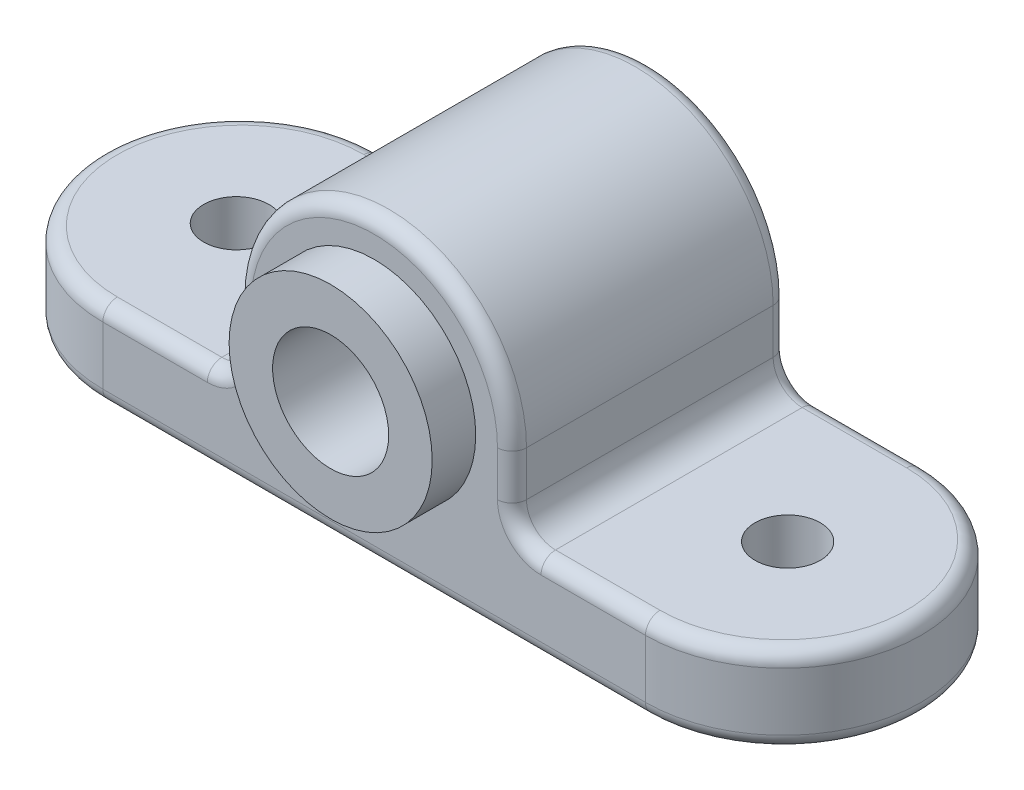
ISO-10303-21;
HEADER;
FILE_DESCRIPTION(('STEP AP214'),'2;1');
FILE_NAME('part.step','',(''),(''),'','','');
FILE_SCHEMA(('AUTOMOTIVE_DESIGN { 1 0 10303 214 1 1 1 1 }'));
ENDSEC;
DATA;
#1=APPLICATION_CONTEXT('core data for automotive mechanical design processes');
#2=APPLICATION_PROTOCOL_DEFINITION('international standard','automotive_design',2000,#1);
#3=PRODUCT_CONTEXT('',#1,'mechanical');
#4=PRODUCT('Part','Part','',(#3));
#5=PRODUCT_RELATED_PRODUCT_CATEGORY('part','',(#4));
#6=PRODUCT_DEFINITION_FORMATION('','',#4);
#7=PRODUCT_DEFINITION_CONTEXT('part definition',#1,'design');
#8=PRODUCT_DEFINITION('design','',#6,#7);
#9=PRODUCT_DEFINITION_SHAPE('','',#8);
#10=(LENGTH_UNIT() NAMED_UNIT(*) SI_UNIT(.MILLI.,.METRE.));
#11=(NAMED_UNIT(*) PLANE_ANGLE_UNIT() SI_UNIT($,.RADIAN.));
#12=(NAMED_UNIT(*) SI_UNIT($,.STERADIAN.) SOLID_ANGLE_UNIT());
#13=UNCERTAINTY_MEASURE_WITH_UNIT(LENGTH_MEASURE(1.E-05),#10,'distance_accuracy_value','');
#14=(GEOMETRIC_REPRESENTATION_CONTEXT(3) GLOBAL_UNCERTAINTY_ASSIGNED_CONTEXT((#13)) GLOBAL_UNIT_ASSIGNED_CONTEXT((#10,
#11,#12)) REPRESENTATION_CONTEXT('',''));
#15=CARTESIAN_POINT('',(0.,0.,0.));
#16=DIRECTION('',(0.,0.,1.));
#17=DIRECTION('',(1.,0.,0.));
#18=AXIS2_PLACEMENT_3D('',#15,#16,#17);
#19=CARTESIAN_POINT('',(11.5,8.,19.));
#20=DIRECTION('',(0.,0.,1.));
#21=DIRECTION('',(1.,0.,0.));
#22=AXIS2_PLACEMENT_3D('',#19,#20,#21);
#23=PLANE('',#22);
#24=DIRECTION('',(0.,-1.,0.));
#25=VECTOR('',#24,1.);
#26=CARTESIAN_POINT('',(-18.7,19.,19.));
#27=LINE('',#26,#25);
#28=CARTESIAN_POINT('',(-18.7,4.99999999999999,19.));
#29=VERTEX_POINT('',#28);
#30=CARTESIAN_POINT('',(-18.7,1.,19.));
#31=VERTEX_POINT('',#30);
#32=EDGE_CURVE('E402',#29,#31,#27,.T.);
#33=ORIENTED_EDGE('',*,*,#32,.T.);
#34=DIRECTION('',(1.,0.,0.));
#35=VECTOR('',#34,1.);
#36=CARTESIAN_POINT('',(18.7,1.,19.));
#37=LINE('',#36,#35);
#38=CARTESIAN_POINT('',(18.7,1.,19.));
#39=VERTEX_POINT('',#38);
#40=EDGE_CURVE('E305',#31,#39,#37,.T.);
#41=ORIENTED_EDGE('',*,*,#40,.T.);
#42=DIRECTION('',(0.,-1.,0.));
#43=VECTOR('',#42,1.);
#44=CARTESIAN_POINT('',(18.7,19.,19.));
#45=LINE('',#44,#43);
#46=CARTESIAN_POINT('',(18.7,5.,19.));
#47=VERTEX_POINT('',#46);
#48=EDGE_CURVE('E415',#47,#39,#45,.T.);
#49=ORIENTED_EDGE('',*,*,#48,.F.);
#50=DIRECTION('',(-1.,0.,0.));
#51=VECTOR('',#50,1.);
#52=CARTESIAN_POINT('',(11.5,5.,19.));
#53=LINE('',#52,#51);
#54=CARTESIAN_POINT('',(11.5,5.,19.));
#55=VERTEX_POINT('',#54);
#56=EDGE_CURVE('E291',#47,#55,#53,.T.);
#57=ORIENTED_EDGE('',*,*,#56,.T.);
#58=CARTESIAN_POINT('',(11.5,8.,19.));
#59=DIRECTION('',(0.,0.,1.));
#60=DIRECTION('',(1.,0.,0.));
#61=AXIS2_PLACEMENT_3D('',#58,#59,#60);
#62=CIRCLE('',#61,3.);
#63=CARTESIAN_POINT('',(8.5,8.00000000000001,19.));
#64=VERTEX_POINT('',#63);
#65=EDGE_CURVE('E293',#55,#64,#62,.F.);
#66=ORIENTED_EDGE('',*,*,#65,.T.);
#67=DIRECTION('',(0.,1.,0.));
#68=VECTOR('',#67,1.);
#69=CARTESIAN_POINT('',(8.5,11.1,19.));
#70=LINE('',#69,#68);
#71=CARTESIAN_POINT('',(8.5,11.1,19.));
#72=VERTEX_POINT('',#71);
#73=EDGE_CURVE('E295',#64,#72,#70,.T.);
#74=ORIENTED_EDGE('',*,*,#73,.T.);
#75=CARTESIAN_POINT('',(0.,11.1,19.));
#76=DIRECTION('',(0.,0.,1.));
#77=DIRECTION('',(1.,0.,0.));
#78=AXIS2_PLACEMENT_3D('',#75,#76,#77);
#79=CIRCLE('',#78,8.5);
#80=CARTESIAN_POINT('',(-8.5,11.1,19.));
#81=VERTEX_POINT('',#80);
#82=EDGE_CURVE('E297',#72,#81,#79,.T.);
#83=ORIENTED_EDGE('',*,*,#82,.T.);
#84=DIRECTION('',(0.,-1.,0.));
#85=VECTOR('',#84,1.);
#86=CARTESIAN_POINT('',(-8.5,8.,19.));
#87=LINE('',#86,#85);
#88=CARTESIAN_POINT('',(-8.5,8.00000000000001,19.));
#89=VERTEX_POINT('',#88);
#90=EDGE_CURVE('E299',#81,#89,#87,.T.);
#91=ORIENTED_EDGE('',*,*,#90,.T.);
#92=CARTESIAN_POINT('',(-11.5,7.99999999999999,19.));
#93=DIRECTION('',(0.,0.,1.));
#94=DIRECTION('',(1.,0.,0.));
#95=AXIS2_PLACEMENT_3D('',#92,#93,#94);
#96=CIRCLE('',#95,3.);
#97=CARTESIAN_POINT('',(-11.5,4.99999999999999,19.));
#98=VERTEX_POINT('',#97);
#99=EDGE_CURVE('E301',#89,#98,#96,.F.);
#100=ORIENTED_EDGE('',*,*,#99,.T.);
#101=DIRECTION('',(-1.,0.,0.));
#102=VECTOR('',#101,1.);
#103=CARTESIAN_POINT('',(-18.7,4.99999999999999,19.));
#104=LINE('',#103,#102);
#105=EDGE_CURVE('E303',#98,#29,#104,.T.);
#106=ORIENTED_EDGE('',*,*,#105,.T.);
#107=EDGE_LOOP('',(#33,#41,#49,#57,#66,#74,#83,#91,#100,#106));
#108=FACE_BOUND('',#107,.T.);
#109=CARTESIAN_POINT('',(0.,11.1,19.));
#110=DIRECTION('',(0.,0.,1.));
#111=DIRECTION('',(1.,0.,0.));
#112=AXIS2_PLACEMENT_3D('',#109,#110,#111);
#113=CIRCLE('',#112,7.);
#114=CARTESIAN_POINT('',(7.,11.1,19.));
#115=VERTEX_POINT('',#114);
#116=EDGE_CURVE('E463',#115,#115,#113,.T.);
#117=ORIENTED_EDGE('',*,*,#116,.F.);
#118=EDGE_LOOP('',(#117));
#119=FACE_BOUND('',#118,.T.);
#120=ADVANCED_FACE('F103',(#108,#119),#23,.T.);
#121=CARTESIAN_POINT('',(28.2,6.,19.));
#122=DIRECTION('',(0.,-1.,0.));
#123=DIRECTION('',(1.,0.,0.));
#124=AXIS2_PLACEMENT_3D('',#121,#122,#123);
#125=PLANE('',#124);
#126=CARTESIAN_POINT('',(19.,6.,9.5));
#127=DIRECTION('',(0.,-1.,0.));
#128=DIRECTION('',(1.,0.,0.));
#129=AXIS2_PLACEMENT_3D('',#126,#127,#128);
#130=CIRCLE('',#129,2.25);
#131=CARTESIAN_POINT('',(21.25,6.,9.5));
#132=VERTEX_POINT('',#131);
#133=EDGE_CURVE('E452',#132,#132,#130,.T.);
#134=ORIENTED_EDGE('',*,*,#133,.T.);
#135=EDGE_LOOP('',(#134));
#136=FACE_BOUND('',#135,.T.);
#137=CARTESIAN_POINT('',(18.7,6.,9.50000000000001));
#138=DIRECTION('',(0.,-1.,0.));
#139=DIRECTION('',(1.,0.,0.));
#140=AXIS2_PLACEMENT_3D('',#137,#138,#139);
#141=CIRCLE('',#140,8.5);
#142=CARTESIAN_POINT('',(18.7,6.,18.));
#143=VERTEX_POINT('',#142);
#144=CARTESIAN_POINT('',(18.7,6.,1.));
#145=VERTEX_POINT('',#144);
#146=EDGE_CURVE('E307',#143,#145,#141,.F.);
#147=ORIENTED_EDGE('',*,*,#146,.T.);
#148=DIRECTION('',(-1.,0.,0.));
#149=VECTOR('',#148,1.);
#150=CARTESIAN_POINT('',(28.2,6.,1.));
#151=LINE('',#150,#149);
#152=CARTESIAN_POINT('',(11.5,6.,1.));
#153=VERTEX_POINT('',#152);
#154=EDGE_CURVE('E311',#145,#153,#151,.T.);
#155=ORIENTED_EDGE('',*,*,#154,.T.);
#156=DIRECTION('',(0.,0.,-1.));
#157=VECTOR('',#156,1.);
#158=CARTESIAN_POINT('',(11.5,6.,19.));
#159=LINE('',#158,#157);
#160=CARTESIAN_POINT('',(11.5,6.,18.));
#161=VERTEX_POINT('',#160);
#162=EDGE_CURVE('E260',#161,#153,#159,.T.);
#163=ORIENTED_EDGE('',*,*,#162,.F.);
#164=DIRECTION('',(-1.,0.,0.));
#165=VECTOR('',#164,1.);
#166=CARTESIAN_POINT('',(18.7,6.,18.));
#167=LINE('',#166,#165);
#168=EDGE_CURVE('E309',#161,#143,#167,.F.);
#169=ORIENTED_EDGE('',*,*,#168,.T.);
#170=EDGE_LOOP('',(#147,#155,#163,#169));
#171=FACE_BOUND('',#170,.T.);
#172=ADVANCED_FACE('F489',(#136,#171),#125,.F.);
#173=CARTESIAN_POINT('',(-28.2,0.,19.));
#174=DIRECTION('',(0.,1.,0.));
#175=DIRECTION('',(0.,0.,1.));
#176=AXIS2_PLACEMENT_3D('',#173,#174,#175);
#177=PLANE('',#176);
#178=CARTESIAN_POINT('',(-18.7,0.,9.5));
#179=DIRECTION('',(0.,1.,0.));
#180=DIRECTION('',(0.,0.,1.));
#181=AXIS2_PLACEMENT_3D('',#178,#179,#180);
#182=CIRCLE('',#181,8.5);
#183=CARTESIAN_POINT('',(-18.7,0.,18.));
#184=VERTEX_POINT('',#183);
#185=CARTESIAN_POINT('',(-18.7,0.,1.));
#186=VERTEX_POINT('',#185);
#187=EDGE_CURVE('E265',#184,#186,#182,.F.);
#188=ORIENTED_EDGE('',*,*,#187,.T.);
#189=DIRECTION('',(1.,0.,0.));
#190=VECTOR('',#189,1.);
#191=CARTESIAN_POINT('',(-28.2,0.,1.));
#192=LINE('',#191,#190);
#193=CARTESIAN_POINT('',(18.7,0.,1.));
#194=VERTEX_POINT('',#193);
#195=EDGE_CURVE('E245',#186,#194,#192,.T.);
#196=ORIENTED_EDGE('',*,*,#195,.T.);
#197=CARTESIAN_POINT('',(18.7,0.,9.50000000000001));
#198=DIRECTION('',(0.,1.,0.));
#199=DIRECTION('',(0.,0.,1.));
#200=AXIS2_PLACEMENT_3D('',#197,#198,#199);
#201=CIRCLE('',#200,8.5);
#202=CARTESIAN_POINT('',(18.7,0.,18.));
#203=VERTEX_POINT('',#202);
#204=EDGE_CURVE('E253',#194,#203,#201,.F.);
#205=ORIENTED_EDGE('',*,*,#204,.T.);
#206=DIRECTION('',(1.,0.,0.));
#207=VECTOR('',#206,1.);
#208=CARTESIAN_POINT('',(-18.7,0.,18.));
#209=LINE('',#208,#207);
#210=EDGE_CURVE('E259',#203,#184,#209,.F.);
#211=ORIENTED_EDGE('',*,*,#210,.T.);
#212=EDGE_LOOP('',(#188,#196,#205,#211));
#213=FACE_BOUND('',#212,.T.);
#214=CARTESIAN_POINT('',(-19.,0.,9.5));
#215=DIRECTION('',(0.,-1.,0.));
#216=DIRECTION('',(0.,0.,-1.));
#217=AXIS2_PLACEMENT_3D('',#214,#215,#216);
#218=CIRCLE('',#217,2.25);
#219=CARTESIAN_POINT('',(-19.,0.,7.25));
#220=VERTEX_POINT('',#219);
#221=EDGE_CURVE('E437',#220,#220,#218,.T.);
#222=ORIENTED_EDGE('',*,*,#221,.F.);
#223=EDGE_LOOP('',(#222));
#224=FACE_BOUND('',#223,.T.);
#225=CARTESIAN_POINT('',(19.,0.,9.5));
#226=DIRECTION('',(0.,-1.,0.));
#227=DIRECTION('',(0.,0.,-1.));
#228=AXIS2_PLACEMENT_3D('',#225,#226,#227);
#229=CIRCLE('',#228,2.25);
#230=CARTESIAN_POINT('',(19.,0.,7.25));
#231=VERTEX_POINT('',#230);
#232=EDGE_CURVE('E436',#231,#231,#229,.T.);
#233=ORIENTED_EDGE('',*,*,#232,.F.);
#234=EDGE_LOOP('',(#233));
#235=FACE_BOUND('',#234,.T.);
#236=ADVANCED_FACE('F262',(#213,#224,#235),#177,.F.);
#237=CARTESIAN_POINT('',(11.5,8.,0.));
#238=DIRECTION('',(0.,0.,1.));
#239=DIRECTION('',(1.,0.,0.));
#240=AXIS2_PLACEMENT_3D('',#237,#238,#239);
#241=PLANE('',#240);
#242=DIRECTION('',(0.,-1.,0.));
#243=VECTOR('',#242,1.);
#244=CARTESIAN_POINT('',(18.7,19.,0.));
#245=LINE('',#244,#243);
#246=CARTESIAN_POINT('',(18.7,5.,0.));
#247=VERTEX_POINT('',#246);
#248=CARTESIAN_POINT('',(18.7,1.,0.));
#249=VERTEX_POINT('',#248);
#250=EDGE_CURVE('E449',#247,#249,#245,.T.);
#251=ORIENTED_EDGE('',*,*,#250,.T.);
#252=DIRECTION('',(1.,0.,0.));
#253=VECTOR('',#252,1.);
#254=CARTESIAN_POINT('',(11.5,1.,0.));
#255=LINE('',#254,#253);
#256=CARTESIAN_POINT('',(-18.7,1.,0.));
#257=VERTEX_POINT('',#256);
#258=EDGE_CURVE('E247',#249,#257,#255,.F.);
#259=ORIENTED_EDGE('',*,*,#258,.T.);
#260=DIRECTION('',(0.,-1.,0.));
#261=VECTOR('',#260,1.);
#262=CARTESIAN_POINT('',(-18.7,19.,0.));
#263=LINE('',#262,#261);
#264=CARTESIAN_POINT('',(-18.7,5.,0.));
#265=VERTEX_POINT('',#264);
#266=EDGE_CURVE('E410',#265,#257,#263,.T.);
#267=ORIENTED_EDGE('',*,*,#266,.F.);
#268=DIRECTION('',(-1.,0.,0.));
#269=VECTOR('',#268,1.);
#270=CARTESIAN_POINT('',(11.5,4.99999999999999,0.));
#271=LINE('',#270,#269);
#272=CARTESIAN_POINT('',(-11.5,4.99999999999999,0.));
#273=VERTEX_POINT('',#272);
#274=EDGE_CURVE('E267',#265,#273,#271,.F.);
#275=ORIENTED_EDGE('',*,*,#274,.T.);
#276=CARTESIAN_POINT('',(-11.5,7.99999999999999,0.));
#277=DIRECTION('',(0.,0.,1.));
#278=DIRECTION('',(1.,0.,0.));
#279=AXIS2_PLACEMENT_3D('',#276,#277,#278);
#280=CIRCLE('',#279,3.);
#281=CARTESIAN_POINT('',(-8.5,8.,0.));
#282=VERTEX_POINT('',#281);
#283=EDGE_CURVE('E269',#273,#282,#280,.T.);
#284=ORIENTED_EDGE('',*,*,#283,.T.);
#285=DIRECTION('',(0.,-1.,0.));
#286=VECTOR('',#285,1.);
#287=CARTESIAN_POINT('',(-8.5,8.,0.));
#288=LINE('',#287,#286);
#289=CARTESIAN_POINT('',(-8.5,11.1,0.));
#290=VERTEX_POINT('',#289);
#291=EDGE_CURVE('E275',#282,#290,#288,.F.);
#292=ORIENTED_EDGE('',*,*,#291,.T.);
#293=CARTESIAN_POINT('',(0.,11.1,0.));
#294=DIRECTION('',(0.,0.,1.));
#295=DIRECTION('',(1.,0.,0.));
#296=AXIS2_PLACEMENT_3D('',#293,#294,#295);
#297=CIRCLE('',#296,8.5);
#298=CARTESIAN_POINT('',(8.5,11.1,0.));
#299=VERTEX_POINT('',#298);
#300=EDGE_CURVE('E277',#290,#299,#297,.F.);
#301=ORIENTED_EDGE('',*,*,#300,.T.);
#302=DIRECTION('',(0.,1.,0.));
#303=VECTOR('',#302,1.);
#304=CARTESIAN_POINT('',(8.5,8.,0.));
#305=LINE('',#304,#303);
#306=CARTESIAN_POINT('',(8.5,8.00000000000002,0.));
#307=VERTEX_POINT('',#306);
#308=EDGE_CURVE('E279',#299,#307,#305,.F.);
#309=ORIENTED_EDGE('',*,*,#308,.T.);
#310=CARTESIAN_POINT('',(11.5,8.,0.));
#311=DIRECTION('',(0.,0.,1.));
#312=DIRECTION('',(1.,0.,0.));
#313=AXIS2_PLACEMENT_3D('',#310,#311,#312);
#314=CIRCLE('',#313,3.);
#315=CARTESIAN_POINT('',(11.5,5.,0.));
#316=VERTEX_POINT('',#315);
#317=EDGE_CURVE('E281',#307,#316,#314,.T.);
#318=ORIENTED_EDGE('',*,*,#317,.T.);
#319=DIRECTION('',(-1.,0.,0.));
#320=VECTOR('',#319,1.);
#321=CARTESIAN_POINT('',(11.5,5.,0.));
#322=LINE('',#321,#320);
#323=EDGE_CURVE('E283',#316,#247,#322,.F.);
#324=ORIENTED_EDGE('',*,*,#323,.T.);
#325=EDGE_LOOP('',(#251,#259,#267,#275,#284,#292,#301,#309,#318,#324));
#326=FACE_BOUND('',#325,.T.);
#327=CARTESIAN_POINT('',(0.,11.1,0.));
#328=DIRECTION('',(0.,0.,1.));
#329=DIRECTION('',(1.,0.,0.));
#330=AXIS2_PLACEMENT_3D('',#327,#328,#329);
#331=CIRCLE('',#330,4.);
#332=CARTESIAN_POINT('',(4.,11.1,0.));
#333=VERTEX_POINT('',#332);
#334=EDGE_CURVE('E409',#333,#333,#331,.T.);
#335=ORIENTED_EDGE('',*,*,#334,.T.);
#336=EDGE_LOOP('',(#335));
#337=FACE_BOUND('',#336,.T.);
#338=ADVANCED_FACE('F445',(#326,#337),#241,.F.);
#339=CARTESIAN_POINT('',(11.5,8.,19.));
#340=DIRECTION('',(0.,0.,-1.));
#341=DIRECTION('',(-1.,0.,0.));
#342=AXIS2_PLACEMENT_3D('',#339,#340,#341);
#343=CYLINDRICAL_SURFACE('',#342,2.);
#344=ORIENTED_EDGE('',*,*,#162,.T.);
#345=CARTESIAN_POINT('',(11.5,8.,1.));
#346=DIRECTION('',(0.,0.,1.));
#347=DIRECTION('',(1.,0.,0.));
#348=AXIS2_PLACEMENT_3D('',#345,#346,#347);
#349=CIRCLE('',#348,2.);
#350=CARTESIAN_POINT('',(9.5,8.00000000000001,1.));
#351=VERTEX_POINT('',#350);
#352=EDGE_CURVE('E316',#153,#351,#349,.F.);
#353=ORIENTED_EDGE('',*,*,#352,.T.);
#354=DIRECTION('',(0.,0.,-1.));
#355=VECTOR('',#354,1.);
#356=CARTESIAN_POINT('',(9.5,8.00000000000001,19.));
#357=LINE('',#356,#355);
#358=CARTESIAN_POINT('',(9.5,8.00000000000001,18.));
#359=VERTEX_POINT('',#358);
#360=EDGE_CURVE('E429',#359,#351,#357,.T.);
#361=ORIENTED_EDGE('',*,*,#360,.F.);
#362=CARTESIAN_POINT('',(11.5,8.,18.));
#363=DIRECTION('',(0.,0.,1.));
#364=DIRECTION('',(1.,0.,0.));
#365=AXIS2_PLACEMENT_3D('',#362,#363,#364);
#366=CIRCLE('',#365,2.);
#367=EDGE_CURVE('E314',#359,#161,#366,.T.);
#368=ORIENTED_EDGE('',*,*,#367,.T.);
#369=EDGE_LOOP('',(#344,#353,#361,#368));
#370=FACE_BOUND('',#369,.T.);
#371=ADVANCED_FACE('F501',(#370),#343,.F.);
#372=CARTESIAN_POINT('',(9.5,11.1,19.));
#373=DIRECTION('',(-1.,0.,0.));
#374=DIRECTION('',(0.,0.,1.));
#375=AXIS2_PLACEMENT_3D('',#372,#373,#374);
#376=PLANE('',#375);
#377=ORIENTED_EDGE('',*,*,#360,.T.);
#378=DIRECTION('',(0.,1.,0.));
#379=VECTOR('',#378,1.);
#380=CARTESIAN_POINT('',(9.5,11.1,1.));
#381=LINE('',#380,#379);
#382=CARTESIAN_POINT('',(9.5,11.1,1.));
#383=VERTEX_POINT('',#382);
#384=EDGE_CURVE('E320',#351,#383,#381,.T.);
#385=ORIENTED_EDGE('',*,*,#384,.T.);
#386=DIRECTION('',(0.,0.,-1.));
#387=VECTOR('',#386,1.);
#388=CARTESIAN_POINT('',(9.5,11.1,19.));
#389=LINE('',#388,#387);
#390=CARTESIAN_POINT('',(9.5,11.1,18.));
#391=VERTEX_POINT('',#390);
#392=EDGE_CURVE('E426',#391,#383,#389,.T.);
#393=ORIENTED_EDGE('',*,*,#392,.F.);
#394=DIRECTION('',(0.,1.,0.));
#395=VECTOR('',#394,1.);
#396=CARTESIAN_POINT('',(9.5,8.00000000000001,18.));
#397=LINE('',#396,#395);
#398=EDGE_CURVE('E318',#391,#359,#397,.F.);
#399=ORIENTED_EDGE('',*,*,#398,.T.);
#400=EDGE_LOOP('',(#377,#385,#393,#399));
#401=FACE_BOUND('',#400,.T.);
#402=ADVANCED_FACE('F519',(#401),#376,.F.);
#403=CARTESIAN_POINT('',(0.,11.1,19.));
#404=DIRECTION('',(0.,0.,-1.));
#405=DIRECTION('',(-1.,0.,0.));
#406=AXIS2_PLACEMENT_3D('',#403,#404,#405);
#407=CYLINDRICAL_SURFACE('',#406,9.5);
#408=ORIENTED_EDGE('',*,*,#392,.T.);
#409=CARTESIAN_POINT('',(0.,11.1,1.));
#410=DIRECTION('',(0.,0.,1.));
#411=DIRECTION('',(1.,0.,0.));
#412=AXIS2_PLACEMENT_3D('',#409,#410,#411);
#413=CIRCLE('',#412,9.5);
#414=CARTESIAN_POINT('',(-9.5,11.1,1.));
#415=VERTEX_POINT('',#414);
#416=EDGE_CURVE('E324',#383,#415,#413,.T.);
#417=ORIENTED_EDGE('',*,*,#416,.T.);
#418=DIRECTION('',(0.,0.,-1.));
#419=VECTOR('',#418,1.);
#420=CARTESIAN_POINT('',(-9.5,11.1,19.));
#421=LINE('',#420,#419);
#422=CARTESIAN_POINT('',(-9.5,11.1,18.));
#423=VERTEX_POINT('',#422);
#424=EDGE_CURVE('E423',#423,#415,#421,.T.);
#425=ORIENTED_EDGE('',*,*,#424,.F.);
#426=CARTESIAN_POINT('',(0.,11.1,18.));
#427=DIRECTION('',(0.,0.,1.));
#428=DIRECTION('',(1.,0.,0.));
#429=AXIS2_PLACEMENT_3D('',#426,#427,#428);
#430=CIRCLE('',#429,9.5);
#431=EDGE_CURVE('E322',#423,#391,#430,.F.);
#432=ORIENTED_EDGE('',*,*,#431,.T.);
#433=EDGE_LOOP('',(#408,#417,#425,#432));
#434=FACE_BOUND('',#433,.T.);
#435=ADVANCED_FACE('F515',(#434),#407,.T.);
#436=CARTESIAN_POINT('',(-9.5,11.1,19.));
#437=DIRECTION('',(1.,0.,0.));
#438=DIRECTION('',(0.,0.,-1.));
#439=AXIS2_PLACEMENT_3D('',#436,#437,#438);
#440=PLANE('',#439);
#441=ORIENTED_EDGE('',*,*,#424,.T.);
#442=DIRECTION('',(0.,-1.,0.));
#443=VECTOR('',#442,1.);
#444=CARTESIAN_POINT('',(-9.5,11.1,1.));
#445=LINE('',#444,#443);
#446=CARTESIAN_POINT('',(-9.5,8.,1.));
#447=VERTEX_POINT('',#446);
#448=EDGE_CURVE('E328',#415,#447,#445,.T.);
#449=ORIENTED_EDGE('',*,*,#448,.T.);
#450=DIRECTION('',(0.,0.,-1.));
#451=VECTOR('',#450,1.);
#452=CARTESIAN_POINT('',(-9.5,8.,19.));
#453=LINE('',#452,#451);
#454=CARTESIAN_POINT('',(-9.5,8.,18.));
#455=VERTEX_POINT('',#454);
#456=EDGE_CURVE('E420',#455,#447,#453,.T.);
#457=ORIENTED_EDGE('',*,*,#456,.F.);
#458=DIRECTION('',(0.,-1.,0.));
#459=VECTOR('',#458,1.);
#460=CARTESIAN_POINT('',(-9.5,11.1,18.));
#461=LINE('',#460,#459);
#462=EDGE_CURVE('E326',#455,#423,#461,.F.);
#463=ORIENTED_EDGE('',*,*,#462,.T.);
#464=EDGE_LOOP('',(#441,#449,#457,#463));
#465=FACE_BOUND('',#464,.T.);
#466=ADVANCED_FACE('F511',(#465),#440,.F.);
#467=CARTESIAN_POINT('',(-11.5,7.99999999999999,19.));
#468=DIRECTION('',(0.,0.,-1.));
#469=DIRECTION('',(-1.,0.,0.));
#470=AXIS2_PLACEMENT_3D('',#467,#468,#469);
#471=CYLINDRICAL_SURFACE('',#470,2.);
#472=ORIENTED_EDGE('',*,*,#456,.T.);
#473=CARTESIAN_POINT('',(-11.5,7.99999999999999,1.));
#474=DIRECTION('',(0.,0.,1.));
#475=DIRECTION('',(1.,0.,0.));
#476=AXIS2_PLACEMENT_3D('',#473,#474,#475);
#477=CIRCLE('',#476,2.);
#478=CARTESIAN_POINT('',(-11.5,5.99999999999999,1.));
#479=VERTEX_POINT('',#478);
#480=EDGE_CURVE('E332',#447,#479,#477,.F.);
#481=ORIENTED_EDGE('',*,*,#480,.T.);
#482=DIRECTION('',(0.,0.,-1.));
#483=VECTOR('',#482,1.);
#484=CARTESIAN_POINT('',(-11.5,5.99999999999999,19.));
#485=LINE('',#484,#483);
#486=CARTESIAN_POINT('',(-11.5,5.99999999999999,18.));
#487=VERTEX_POINT('',#486);
#488=EDGE_CURVE('E413',#487,#479,#485,.T.);
#489=ORIENTED_EDGE('',*,*,#488,.F.);
#490=CARTESIAN_POINT('',(-11.5,7.99999999999999,18.));
#491=DIRECTION('',(0.,0.,1.));
#492=DIRECTION('',(1.,0.,0.));
#493=AXIS2_PLACEMENT_3D('',#490,#491,#492);
#494=CIRCLE('',#493,2.);
#495=EDGE_CURVE('E330',#487,#455,#494,.T.);
#496=ORIENTED_EDGE('',*,*,#495,.T.);
#497=EDGE_LOOP('',(#472,#481,#489,#496));
#498=FACE_BOUND('',#497,.T.);
#499=ADVANCED_FACE('F507',(#498),#471,.F.);
#500=CARTESIAN_POINT('',(-28.2,6.,19.));
#501=DIRECTION('',(0.,-1.,0.));
#502=DIRECTION('',(1.,0.,0.));
#503=AXIS2_PLACEMENT_3D('',#500,#501,#502);
#504=PLANE('',#503);
#505=CARTESIAN_POINT('',(-19.,5.99999999999999,9.5));
#506=DIRECTION('',(0.,-1.,0.));
#507=DIRECTION('',(1.,0.,0.));
#508=AXIS2_PLACEMENT_3D('',#505,#506,#507);
#509=CIRCLE('',#508,2.25);
#510=CARTESIAN_POINT('',(-16.75,5.99999999999999,9.5));
#511=VERTEX_POINT('',#510);
#512=EDGE_CURVE('E434',#511,#511,#509,.T.);
#513=ORIENTED_EDGE('',*,*,#512,.T.);
#514=EDGE_LOOP('',(#513));
#515=FACE_BOUND('',#514,.T.);
#516=ORIENTED_EDGE('',*,*,#488,.T.);
#517=DIRECTION('',(-1.,0.,0.));
#518=VECTOR('',#517,1.);
#519=CARTESIAN_POINT('',(-28.2,6.,1.));
#520=LINE('',#519,#518);
#521=CARTESIAN_POINT('',(-18.7,5.99999999999999,1.));
#522=VERTEX_POINT('',#521);
#523=EDGE_CURVE('E120',#479,#522,#520,.T.);
#524=ORIENTED_EDGE('',*,*,#523,.T.);
#525=CARTESIAN_POINT('',(-18.7,5.99999999999999,9.5));
#526=DIRECTION('',(0.,-1.,0.));
#527=DIRECTION('',(1.,0.,0.));
#528=AXIS2_PLACEMENT_3D('',#525,#526,#527);
#529=CIRCLE('',#528,8.5);
#530=CARTESIAN_POINT('',(-18.7,5.99999999999999,18.));
#531=VERTEX_POINT('',#530);
#532=EDGE_CURVE('E124',#522,#531,#529,.F.);
#533=ORIENTED_EDGE('',*,*,#532,.T.);
#534=DIRECTION('',(-1.,0.,0.));
#535=VECTOR('',#534,1.);
#536=CARTESIAN_POINT('',(-11.5,5.99999999999999,18.));
#537=LINE('',#536,#535);
#538=EDGE_CURVE('E334',#531,#487,#537,.F.);
#539=ORIENTED_EDGE('',*,*,#538,.T.);
#540=EDGE_LOOP('',(#516,#524,#533,#539));
#541=FACE_BOUND('',#540,.T.);
#542=ADVANCED_FACE('F504',(#515,#541),#504,.F.);
#543=CARTESIAN_POINT('',(0.,11.1,19.));
#544=DIRECTION('',(0.,0.,-1.));
#545=DIRECTION('',(-1.,0.,0.));
#546=AXIS2_PLACEMENT_3D('',#543,#544,#545);
#547=CYLINDRICAL_SURFACE('',#546,4.);
#548=ORIENTED_EDGE('',*,*,#334,.F.);
#549=EDGE_LOOP('',(#548));
#550=FACE_BOUND('',#549,.T.);
#551=CARTESIAN_POINT('',(0.,11.1,22.));
#552=DIRECTION('',(0.,0.,1.));
#553=DIRECTION('',(1.,0.,0.));
#554=AXIS2_PLACEMENT_3D('',#551,#552,#553);
#555=CIRCLE('',#554,4.);
#556=CARTESIAN_POINT('',(4.,11.1,22.));
#557=VERTEX_POINT('',#556);
#558=EDGE_CURVE('E344',#557,#557,#555,.T.);
#559=ORIENTED_EDGE('',*,*,#558,.T.);
#560=EDGE_LOOP('',(#559));
#561=FACE_BOUND('',#560,.T.);
#562=ADVANCED_FACE('F471',(#550,#561),#547,.F.);
#563=CARTESIAN_POINT('',(-18.7,19.,9.5));
#564=DIRECTION('',(0.,-1.,0.));
#565=DIRECTION('',(0.,0.,-1.));
#566=AXIS2_PLACEMENT_3D('',#563,#564,#565);
#567=CYLINDRICAL_SURFACE('',#566,9.5);
#568=ORIENTED_EDGE('',*,*,#266,.T.);
#569=CARTESIAN_POINT('',(-18.7,1.,9.5));
#570=DIRECTION('',(0.,1.,0.));
#571=DIRECTION('',(0.,0.,1.));
#572=AXIS2_PLACEMENT_3D('',#569,#570,#571);
#573=CIRCLE('',#572,9.5);
#574=EDGE_CURVE('E289',#257,#31,#573,.T.);
#575=ORIENTED_EDGE('',*,*,#574,.T.);
#576=ORIENTED_EDGE('',*,*,#32,.F.);
#577=CARTESIAN_POINT('',(-18.7,5.,9.5));
#578=DIRECTION('',(0.,-1.,0.));
#579=DIRECTION('',(1.,0.,0.));
#580=AXIS2_PLACEMENT_3D('',#577,#578,#579);
#581=CIRCLE('',#580,9.5);
#582=EDGE_CURVE('E287',#29,#265,#581,.T.);
#583=ORIENTED_EDGE('',*,*,#582,.T.);
#584=EDGE_LOOP('',(#568,#575,#576,#583));
#585=FACE_BOUND('',#584,.T.);
#586=ADVANCED_FACE('F406',(#585),#567,.T.);
#587=CARTESIAN_POINT('',(18.7,19.,9.50000000000001));
#588=DIRECTION('',(0.,-1.,0.));
#589=DIRECTION('',(0.,0.,-1.));
#590=AXIS2_PLACEMENT_3D('',#587,#588,#589);
#591=CYLINDRICAL_SURFACE('',#590,9.50000000000001);
#592=ORIENTED_EDGE('',*,*,#48,.T.);
#593=CARTESIAN_POINT('',(18.7,1.,9.50000000000001));
#594=DIRECTION('',(0.,1.,0.));
#595=DIRECTION('',(0.,0.,1.));
#596=AXIS2_PLACEMENT_3D('',#593,#594,#595);
#597=CIRCLE('',#596,9.50000000000001);
#598=EDGE_CURVE('E12',#39,#249,#597,.T.);
#599=ORIENTED_EDGE('',*,*,#598,.T.);
#600=ORIENTED_EDGE('',*,*,#250,.F.);
#601=CARTESIAN_POINT('',(18.7,5.,9.50000000000001));
#602=DIRECTION('',(0.,-1.,0.));
#603=DIRECTION('',(1.,0.,0.));
#604=AXIS2_PLACEMENT_3D('',#601,#602,#603);
#605=CIRCLE('',#604,9.50000000000001);
#606=EDGE_CURVE('E112',#247,#47,#605,.T.);
#607=ORIENTED_EDGE('',*,*,#606,.T.);
#608=EDGE_LOOP('',(#592,#599,#600,#607));
#609=FACE_BOUND('',#608,.T.);
#610=ADVANCED_FACE('F647',(#609),#591,.T.);
#611=CARTESIAN_POINT('',(19.,19.,9.5));
#612=DIRECTION('',(0.,-1.,0.));
#613=DIRECTION('',(0.,0.,-1.));
#614=AXIS2_PLACEMENT_3D('',#611,#612,#613);
#615=CYLINDRICAL_SURFACE('',#614,2.25);
#616=ORIENTED_EDGE('',*,*,#232,.T.);
#617=EDGE_LOOP('',(#616));
#618=FACE_BOUND('',#617,.T.);
#619=ORIENTED_EDGE('',*,*,#133,.F.);
#620=EDGE_LOOP('',(#619));
#621=FACE_BOUND('',#620,.T.);
#622=ADVANCED_FACE('F485',(#618,#621),#615,.F.);
#623=CARTESIAN_POINT('',(-19.,19.,9.5));
#624=DIRECTION('',(0.,-1.,0.));
#625=DIRECTION('',(0.,0.,-1.));
#626=AXIS2_PLACEMENT_3D('',#623,#624,#625);
#627=CYLINDRICAL_SURFACE('',#626,2.25);
#628=ORIENTED_EDGE('',*,*,#221,.T.);
#629=EDGE_LOOP('',(#628));
#630=FACE_BOUND('',#629,.T.);
#631=ORIENTED_EDGE('',*,*,#512,.F.);
#632=EDGE_LOOP('',(#631));
#633=FACE_BOUND('',#632,.T.);
#634=ADVANCED_FACE('F476',(#630,#633),#627,.F.);
#635=CARTESIAN_POINT('',(0.,11.1,22.));
#636=DIRECTION('',(0.,0.,1.));
#637=DIRECTION('',(1.,0.,0.));
#638=AXIS2_PLACEMENT_3D('',#635,#636,#637);
#639=PLANE('',#638);
#640=CARTESIAN_POINT('',(0.,11.1,22.));
#641=DIRECTION('',(0.,0.,1.));
#642=DIRECTION('',(1.,0.,0.));
#643=AXIS2_PLACEMENT_3D('',#640,#641,#642);
#644=CIRCLE('',#643,7.);
#645=CARTESIAN_POINT('',(7.,11.1,22.));
#646=VERTEX_POINT('',#645);
#647=EDGE_CURVE('E462',#646,#646,#644,.T.);
#648=ORIENTED_EDGE('',*,*,#647,.T.);
#649=EDGE_LOOP('',(#648));
#650=FACE_BOUND('',#649,.T.);
#651=ORIENTED_EDGE('',*,*,#558,.F.);
#652=EDGE_LOOP('',(#651));
#653=FACE_BOUND('',#652,.T.);
#654=ADVANCED_FACE('F473',(#650,#653),#639,.T.);
#655=CARTESIAN_POINT('',(0.,11.1,22.));
#656=DIRECTION('',(0.,0.,-1.));
#657=DIRECTION('',(-1.,0.,0.));
#658=AXIS2_PLACEMENT_3D('',#655,#656,#657);
#659=CYLINDRICAL_SURFACE('',#658,7.);
#660=ORIENTED_EDGE('',*,*,#647,.F.);
#661=EDGE_LOOP('',(#660));
#662=FACE_BOUND('',#661,.T.);
#663=ORIENTED_EDGE('',*,*,#116,.T.);
#664=EDGE_LOOP('',(#663));
#665=FACE_BOUND('',#664,.T.);
#666=ADVANCED_FACE('F475',(#662,#665),#659,.T.);
#667=CARTESIAN_POINT('',(11.5,1.,18.));
#668=DIRECTION('',(-1.,0.,0.));
#669=DIRECTION('',(0.,0.,1.));
#670=AXIS2_PLACEMENT_3D('',#667,#668,#669);
#671=CYLINDRICAL_SURFACE('',#670,1.);
#672=CARTESIAN_POINT('',(18.7,1.,18.));
#673=DIRECTION('',(1.,0.,0.));
#674=DIRECTION('',(0.,0.,-1.));
#675=AXIS2_PLACEMENT_3D('',#672,#673,#674);
#676=CIRCLE('',#675,1.);
#677=EDGE_CURVE('E256',#39,#203,#676,.T.);
#678=ORIENTED_EDGE('',*,*,#677,.F.);
#679=ORIENTED_EDGE('',*,*,#40,.F.);
#680=CARTESIAN_POINT('',(-18.7,1.,18.));
#681=DIRECTION('',(-1.,0.,0.));
#682=DIRECTION('',(0.,0.,1.));
#683=AXIS2_PLACEMENT_3D('',#680,#681,#682);
#684=CIRCLE('',#683,1.);
#685=EDGE_CURVE('E341',#184,#31,#684,.T.);
#686=ORIENTED_EDGE('',*,*,#685,.F.);
#687=ORIENTED_EDGE('',*,*,#210,.F.);
#688=EDGE_LOOP('',(#678,#679,#686,#687));
#689=FACE_BOUND('',#688,.T.);
#690=ADVANCED_FACE('F440',(#689),#671,.T.);
#691=CARTESIAN_POINT('',(-18.7,1.,9.5));
#692=DIRECTION('',(0.,1.,0.));
#693=DIRECTION('',(0.,0.,1.));
#694=AXIS2_PLACEMENT_3D('',#691,#692,#693);
#695=TOROIDAL_SURFACE('',#694,8.5,1.);
#696=ORIENTED_EDGE('',*,*,#685,.T.);
#697=ORIENTED_EDGE('',*,*,#574,.F.);
#698=CARTESIAN_POINT('',(-18.7,1.,1.));
#699=DIRECTION('',(1.,0.,0.));
#700=DIRECTION('',(0.,0.,-1.));
#701=AXIS2_PLACEMENT_3D('',#698,#699,#700);
#702=CIRCLE('',#701,1.);
#703=EDGE_CURVE('E250',#186,#257,#702,.T.);
#704=ORIENTED_EDGE('',*,*,#703,.F.);
#705=ORIENTED_EDGE('',*,*,#187,.F.);
#706=EDGE_LOOP('',(#696,#697,#704,#705));
#707=FACE_BOUND('',#706,.T.);
#708=ADVANCED_FACE('F442',(#707),#695,.T.);
#709=CARTESIAN_POINT('',(18.7,1.,9.50000000000001));
#710=DIRECTION('',(0.,1.,0.));
#711=DIRECTION('',(0.,0.,1.));
#712=AXIS2_PLACEMENT_3D('',#709,#710,#711);
#713=TOROIDAL_SURFACE('',#712,8.5,1.);
#714=ORIENTED_EDGE('',*,*,#677,.T.);
#715=ORIENTED_EDGE('',*,*,#204,.F.);
#716=CARTESIAN_POINT('',(18.7,1.,1.));
#717=DIRECTION('',(-1.,0.,0.));
#718=DIRECTION('',(0.,0.,1.));
#719=AXIS2_PLACEMENT_3D('',#716,#717,#718);
#720=CIRCLE('',#719,1.);
#721=EDGE_CURVE('E241',#249,#194,#720,.T.);
#722=ORIENTED_EDGE('',*,*,#721,.F.);
#723=ORIENTED_EDGE('',*,*,#598,.F.);
#724=EDGE_LOOP('',(#714,#715,#722,#723));
#725=FACE_BOUND('',#724,.T.);
#726=ADVANCED_FACE('F254',(#725),#713,.T.);
#727=CARTESIAN_POINT('',(-28.2,1.,1.));
#728=DIRECTION('',(1.,0.,0.));
#729=DIRECTION('',(0.,0.,-1.));
#730=AXIS2_PLACEMENT_3D('',#727,#728,#729);
#731=CYLINDRICAL_SURFACE('',#730,1.);
#732=ORIENTED_EDGE('',*,*,#703,.T.);
#733=ORIENTED_EDGE('',*,*,#258,.F.);
#734=ORIENTED_EDGE('',*,*,#721,.T.);
#735=ORIENTED_EDGE('',*,*,#195,.F.);
#736=EDGE_LOOP('',(#732,#733,#734,#735));
#737=FACE_BOUND('',#736,.T.);
#738=ADVANCED_FACE('F243',(#737),#731,.T.);
#739=CARTESIAN_POINT('',(11.5,4.99999999999999,18.));
#740=DIRECTION('',(1.,0.,0.));
#741=DIRECTION('',(0.,1.,0.));
#742=AXIS2_PLACEMENT_3D('',#739,#740,#741);
#743=CYLINDRICAL_SURFACE('',#742,1.);
#744=CARTESIAN_POINT('',(-18.7,4.99999999999999,18.));
#745=DIRECTION('',(-1.,0.,0.));
#746=DIRECTION('',(0.,0.,1.));
#747=AXIS2_PLACEMENT_3D('',#744,#745,#746);
#748=CIRCLE('',#747,1.);
#749=EDGE_CURVE('E384',#29,#531,#748,.T.);
#750=ORIENTED_EDGE('',*,*,#749,.F.);
#751=ORIENTED_EDGE('',*,*,#105,.F.);
#752=CARTESIAN_POINT('',(-11.5,4.99999999999999,18.));
#753=DIRECTION('',(1.,0.,0.));
#754=DIRECTION('',(0.,0.,-1.));
#755=AXIS2_PLACEMENT_3D('',#752,#753,#754);
#756=CIRCLE('',#755,1.);
#757=EDGE_CURVE('E107',#487,#98,#756,.T.);
#758=ORIENTED_EDGE('',*,*,#757,.F.);
#759=ORIENTED_EDGE('',*,*,#538,.F.);
#760=EDGE_LOOP('',(#750,#751,#758,#759));
#761=FACE_BOUND('',#760,.T.);
#762=ADVANCED_FACE('F105',(#761),#743,.T.);
#763=CARTESIAN_POINT('',(-11.5,7.99999999999999,18.));
#764=DIRECTION('',(0.,0.,1.));
#765=DIRECTION('',(1.,0.,0.));
#766=AXIS2_PLACEMENT_3D('',#763,#764,#765);
#767=TOROIDAL_SURFACE('',#766,3.,1.);
#768=ORIENTED_EDGE('',*,*,#757,.T.);
#769=ORIENTED_EDGE('',*,*,#99,.F.);
#770=CARTESIAN_POINT('',(-8.5,8.00000000000001,18.));
#771=DIRECTION('',(0.,1.,0.));
#772=DIRECTION('',(-1.,0.,0.));
#773=AXIS2_PLACEMENT_3D('',#770,#771,#772);
#774=CIRCLE('',#773,1.);
#775=EDGE_CURVE('E382',#455,#89,#774,.T.);
#776=ORIENTED_EDGE('',*,*,#775,.F.);
#777=ORIENTED_EDGE('',*,*,#495,.F.);
#778=EDGE_LOOP('',(#768,#769,#776,#777));
#779=FACE_BOUND('',#778,.T.);
#780=ADVANCED_FACE('F394',(#779),#767,.T.);
#781=CARTESIAN_POINT('',(-18.7,5.,9.5));
#782=DIRECTION('',(0.,-1.,0.));
#783=DIRECTION('',(1.,0.,0.));
#784=AXIS2_PLACEMENT_3D('',#781,#782,#783);
#785=TOROIDAL_SURFACE('',#784,8.5,1.);
#786=ORIENTED_EDGE('',*,*,#749,.T.);
#787=ORIENTED_EDGE('',*,*,#532,.F.);
#788=CARTESIAN_POINT('',(-18.7,5.,1.));
#789=DIRECTION('',(1.,0.,0.));
#790=DIRECTION('',(0.,0.,-1.));
#791=AXIS2_PLACEMENT_3D('',#788,#789,#790);
#792=CIRCLE('',#791,1.);
#793=EDGE_CURVE('E379',#265,#522,#792,.T.);
#794=ORIENTED_EDGE('',*,*,#793,.F.);
#795=ORIENTED_EDGE('',*,*,#582,.F.);
#796=EDGE_LOOP('',(#786,#787,#794,#795));
#797=FACE_BOUND('',#796,.T.);
#798=ADVANCED_FACE('F586',(#797),#785,.T.);
#799=CARTESIAN_POINT('',(-8.5,8.,18.));
#800=DIRECTION('',(0.,1.,0.));
#801=DIRECTION('',(0.,0.,1.));
#802=AXIS2_PLACEMENT_3D('',#799,#800,#801);
#803=CYLINDRICAL_SURFACE('',#802,1.);
#804=ORIENTED_EDGE('',*,*,#775,.T.);
#805=ORIENTED_EDGE('',*,*,#90,.F.);
#806=CARTESIAN_POINT('',(-8.5,11.1,18.));
#807=DIRECTION('',(0.,1.,0.));
#808=DIRECTION('',(0.,0.,1.));
#809=AXIS2_PLACEMENT_3D('',#806,#807,#808);
#810=CIRCLE('',#809,1.);
#811=EDGE_CURVE('E376',#423,#81,#810,.T.);
#812=ORIENTED_EDGE('',*,*,#811,.F.);
#813=ORIENTED_EDGE('',*,*,#462,.F.);
#814=EDGE_LOOP('',(#804,#805,#812,#813));
#815=FACE_BOUND('',#814,.T.);
#816=ADVANCED_FACE('F582',(#815),#803,.T.);
#817=CARTESIAN_POINT('',(-28.2,5.,1.));
#818=DIRECTION('',(-1.,0.,0.));
#819=DIRECTION('',(0.,-1.,0.));
#820=AXIS2_PLACEMENT_3D('',#817,#818,#819);
#821=CYLINDRICAL_SURFACE('',#820,1.);
#822=ORIENTED_EDGE('',*,*,#793,.T.);
#823=ORIENTED_EDGE('',*,*,#523,.F.);
#824=CARTESIAN_POINT('',(-11.5,4.99999999999999,1.));
#825=DIRECTION('',(1.,0.,0.));
#826=DIRECTION('',(0.,1.,0.));
#827=AXIS2_PLACEMENT_3D('',#824,#825,#826);
#828=CIRCLE('',#827,1.);
#829=EDGE_CURVE('E373',#273,#479,#828,.T.);
#830=ORIENTED_EDGE('',*,*,#829,.F.);
#831=ORIENTED_EDGE('',*,*,#274,.F.);
#832=EDGE_LOOP('',(#822,#823,#830,#831));
#833=FACE_BOUND('',#832,.T.);
#834=ADVANCED_FACE('F578',(#833),#821,.T.);
#835=CARTESIAN_POINT('',(0.,11.1,18.));
#836=DIRECTION('',(0.,0.,1.));
#837=DIRECTION('',(1.,0.,0.));
#838=AXIS2_PLACEMENT_3D('',#835,#836,#837);
#839=TOROIDAL_SURFACE('',#838,8.5,1.);
#840=ORIENTED_EDGE('',*,*,#811,.T.);
#841=ORIENTED_EDGE('',*,*,#82,.F.);
#842=CARTESIAN_POINT('',(8.5,11.1,18.));
#843=DIRECTION('',(0.,-1.,0.));
#844=DIRECTION('',(0.,0.,-1.));
#845=AXIS2_PLACEMENT_3D('',#842,#843,#844);
#846=CIRCLE('',#845,1.);
#847=EDGE_CURVE('E370',#391,#72,#846,.T.);
#848=ORIENTED_EDGE('',*,*,#847,.F.);
#849=ORIENTED_EDGE('',*,*,#431,.F.);
#850=EDGE_LOOP('',(#840,#841,#848,#849));
#851=FACE_BOUND('',#850,.T.);
#852=ADVANCED_FACE('F574',(#851),#839,.T.);
#853=CARTESIAN_POINT('',(-11.5,7.99999999999999,1.));
#854=DIRECTION('',(0.,0.,1.));
#855=DIRECTION('',(1.,0.,0.));
#856=AXIS2_PLACEMENT_3D('',#853,#854,#855);
#857=TOROIDAL_SURFACE('',#856,3.,1.);
#858=ORIENTED_EDGE('',*,*,#829,.T.);
#859=ORIENTED_EDGE('',*,*,#480,.F.);
#860=CARTESIAN_POINT('',(-8.5,8.,1.));
#861=DIRECTION('',(0.,1.,0.));
#862=DIRECTION('',(0.,0.,1.));
#863=AXIS2_PLACEMENT_3D('',#860,#861,#862);
#864=CIRCLE('',#863,1.);
#865=EDGE_CURVE('E367',#282,#447,#864,.T.);
#866=ORIENTED_EDGE('',*,*,#865,.F.);
#867=ORIENTED_EDGE('',*,*,#283,.F.);
#868=EDGE_LOOP('',(#858,#859,#866,#867));
#869=FACE_BOUND('',#868,.T.);
#870=ADVANCED_FACE('F570',(#869),#857,.T.);
#871=CARTESIAN_POINT('',(8.5,8.,18.));
#872=DIRECTION('',(0.,-1.,0.));
#873=DIRECTION('',(0.,0.,-1.));
#874=AXIS2_PLACEMENT_3D('',#871,#872,#873);
#875=CYLINDRICAL_SURFACE('',#874,1.);
#876=ORIENTED_EDGE('',*,*,#847,.T.);
#877=ORIENTED_EDGE('',*,*,#73,.F.);
#878=CARTESIAN_POINT('',(8.5,8.00000000000001,18.));
#879=DIRECTION('',(0.,-1.,0.));
#880=DIRECTION('',(0.,0.,-1.));
#881=AXIS2_PLACEMENT_3D('',#878,#879,#880);
#882=CIRCLE('',#881,1.);
#883=EDGE_CURVE('E364',#359,#64,#882,.T.);
#884=ORIENTED_EDGE('',*,*,#883,.F.);
#885=ORIENTED_EDGE('',*,*,#398,.F.);
#886=EDGE_LOOP('',(#876,#877,#884,#885));
#887=FACE_BOUND('',#886,.T.);
#888=ADVANCED_FACE('F566',(#887),#875,.T.);
#889=CARTESIAN_POINT('',(-8.5,11.1,1.));
#890=DIRECTION('',(0.,-1.,0.));
#891=DIRECTION('',(0.,0.,-1.));
#892=AXIS2_PLACEMENT_3D('',#889,#890,#891);
#893=CYLINDRICAL_SURFACE('',#892,1.);
#894=ORIENTED_EDGE('',*,*,#865,.T.);
#895=ORIENTED_EDGE('',*,*,#448,.F.);
#896=CARTESIAN_POINT('',(-8.5,11.1,1.));
#897=DIRECTION('',(0.,1.,0.));
#898=DIRECTION('',(0.,0.,1.));
#899=AXIS2_PLACEMENT_3D('',#896,#897,#898);
#900=CIRCLE('',#899,1.);
#901=EDGE_CURVE('E361',#290,#415,#900,.T.);
#902=ORIENTED_EDGE('',*,*,#901,.F.);
#903=ORIENTED_EDGE('',*,*,#291,.F.);
#904=EDGE_LOOP('',(#894,#895,#902,#903));
#905=FACE_BOUND('',#904,.T.);
#906=ADVANCED_FACE('F562',(#905),#893,.T.);
#907=CARTESIAN_POINT('',(11.5,8.,18.));
#908=DIRECTION('',(0.,0.,1.));
#909=DIRECTION('',(1.,0.,0.));
#910=AXIS2_PLACEMENT_3D('',#907,#908,#909);
#911=TOROIDAL_SURFACE('',#910,3.,1.);
#912=ORIENTED_EDGE('',*,*,#883,.T.);
#913=ORIENTED_EDGE('',*,*,#65,.F.);
#914=CARTESIAN_POINT('',(11.5,5.,18.));
#915=DIRECTION('',(1.,0.,0.));
#916=DIRECTION('',(0.,1.,0.));
#917=AXIS2_PLACEMENT_3D('',#914,#915,#916);
#918=CIRCLE('',#917,1.);
#919=EDGE_CURVE('E358',#161,#55,#918,.T.);
#920=ORIENTED_EDGE('',*,*,#919,.F.);
#921=ORIENTED_EDGE('',*,*,#367,.F.);
#922=EDGE_LOOP('',(#912,#913,#920,#921));
#923=FACE_BOUND('',#922,.T.);
#924=ADVANCED_FACE('F558',(#923),#911,.T.);
#925=CARTESIAN_POINT('',(0.,11.1,1.));
#926=DIRECTION('',(0.,0.,1.));
#927=DIRECTION('',(1.,0.,0.));
#928=AXIS2_PLACEMENT_3D('',#925,#926,#927);
#929=TOROIDAL_SURFACE('',#928,8.5,1.);
#930=ORIENTED_EDGE('',*,*,#901,.T.);
#931=ORIENTED_EDGE('',*,*,#416,.F.);
#932=CARTESIAN_POINT('',(8.5,11.1,1.));
#933=DIRECTION('',(0.,-1.,0.));
#934=DIRECTION('',(0.,0.,-1.));
#935=AXIS2_PLACEMENT_3D('',#932,#933,#934);
#936=CIRCLE('',#935,1.);
#937=EDGE_CURVE('E355',#299,#383,#936,.T.);
#938=ORIENTED_EDGE('',*,*,#937,.F.);
#939=ORIENTED_EDGE('',*,*,#300,.F.);
#940=EDGE_LOOP('',(#930,#931,#938,#939));
#941=FACE_BOUND('',#940,.T.);
#942=ADVANCED_FACE('F554',(#941),#929,.T.);
#943=CARTESIAN_POINT('',(11.5,5.,18.));
#944=DIRECTION('',(1.,0.,0.));
#945=DIRECTION('',(0.,1.,0.));
#946=AXIS2_PLACEMENT_3D('',#943,#944,#945);
#947=CYLINDRICAL_SURFACE('',#946,1.);
#948=ORIENTED_EDGE('',*,*,#919,.T.);
#949=ORIENTED_EDGE('',*,*,#56,.F.);
#950=CARTESIAN_POINT('',(18.7,5.,18.));
#951=DIRECTION('',(1.,0.,0.));
#952=DIRECTION('',(0.,0.,-1.));
#953=AXIS2_PLACEMENT_3D('',#950,#951,#952);
#954=CIRCLE('',#953,1.);
#955=EDGE_CURVE('E352',#143,#47,#954,.T.);
#956=ORIENTED_EDGE('',*,*,#955,.F.);
#957=ORIENTED_EDGE('',*,*,#168,.F.);
#958=EDGE_LOOP('',(#948,#949,#956,#957));
#959=FACE_BOUND('',#958,.T.);
#960=ADVANCED_FACE('F550',(#959),#947,.T.);
#961=CARTESIAN_POINT('',(8.5,11.1,1.));
#962=DIRECTION('',(0.,1.,0.));
#963=DIRECTION('',(0.,0.,1.));
#964=AXIS2_PLACEMENT_3D('',#961,#962,#963);
#965=CYLINDRICAL_SURFACE('',#964,1.);
#966=ORIENTED_EDGE('',*,*,#937,.T.);
#967=ORIENTED_EDGE('',*,*,#384,.F.);
#968=CARTESIAN_POINT('',(8.5,8.00000000000002,1.));
#969=DIRECTION('',(0.,-1.,0.));
#970=DIRECTION('',(1.,0.,0.));
#971=AXIS2_PLACEMENT_3D('',#968,#969,#970);
#972=CIRCLE('',#971,1.);
#973=EDGE_CURVE('E349',#307,#351,#972,.T.);
#974=ORIENTED_EDGE('',*,*,#973,.F.);
#975=ORIENTED_EDGE('',*,*,#308,.F.);
#976=EDGE_LOOP('',(#966,#967,#974,#975));
#977=FACE_BOUND('',#976,.T.);
#978=ADVANCED_FACE('F546',(#977),#965,.T.);
#979=CARTESIAN_POINT('',(18.7,5.,9.50000000000001));
#980=DIRECTION('',(0.,-1.,0.));
#981=DIRECTION('',(1.,0.,0.));
#982=AXIS2_PLACEMENT_3D('',#979,#980,#981);
#983=TOROIDAL_SURFACE('',#982,8.5,1.);
#984=ORIENTED_EDGE('',*,*,#955,.T.);
#985=ORIENTED_EDGE('',*,*,#606,.F.);
#986=CARTESIAN_POINT('',(18.7,5.,1.));
#987=DIRECTION('',(-1.,0.,0.));
#988=DIRECTION('',(0.,0.,1.));
#989=AXIS2_PLACEMENT_3D('',#986,#987,#988);
#990=CIRCLE('',#989,1.);
#991=EDGE_CURVE('E347',#145,#247,#990,.T.);
#992=ORIENTED_EDGE('',*,*,#991,.F.);
#993=ORIENTED_EDGE('',*,*,#146,.F.);
#994=EDGE_LOOP('',(#984,#985,#992,#993));
#995=FACE_BOUND('',#994,.T.);
#996=ADVANCED_FACE('F542',(#995),#983,.T.);
#997=CARTESIAN_POINT('',(11.5,8.,1.));
#998=DIRECTION('',(0.,0.,1.));
#999=DIRECTION('',(1.,0.,0.));
#1000=AXIS2_PLACEMENT_3D('',#997,#998,#999);
#1001=TOROIDAL_SURFACE('',#1000,3.,1.);
#1002=ORIENTED_EDGE('',*,*,#973,.T.);
#1003=ORIENTED_EDGE('',*,*,#352,.F.);
#1004=CARTESIAN_POINT('',(11.5,5.,1.));
#1005=DIRECTION('',(1.,0.,0.));
#1006=DIRECTION('',(0.,0.,-1.));
#1007=AXIS2_PLACEMENT_3D('',#1004,#1005,#1006);
#1008=CIRCLE('',#1007,1.);
#1009=EDGE_CURVE('E345',#316,#153,#1008,.T.);
#1010=ORIENTED_EDGE('',*,*,#1009,.F.);
#1011=ORIENTED_EDGE('',*,*,#317,.F.);
#1012=EDGE_LOOP('',(#1002,#1003,#1010,#1011));
#1013=FACE_BOUND('',#1012,.T.);
#1014=ADVANCED_FACE('F538',(#1013),#1001,.T.);
#1015=CARTESIAN_POINT('',(28.2,5.,1.));
#1016=DIRECTION('',(-1.,0.,0.));
#1017=DIRECTION('',(0.,-1.,0.));
#1018=AXIS2_PLACEMENT_3D('',#1015,#1016,#1017);
#1019=CYLINDRICAL_SURFACE('',#1018,1.);
#1020=ORIENTED_EDGE('',*,*,#991,.T.);
#1021=ORIENTED_EDGE('',*,*,#323,.F.);
#1022=ORIENTED_EDGE('',*,*,#1009,.T.);
#1023=ORIENTED_EDGE('',*,*,#154,.F.);
#1024=EDGE_LOOP('',(#1020,#1021,#1022,#1023));
#1025=FACE_BOUND('',#1024,.T.);
#1026=ADVANCED_FACE('F535',(#1025),#1019,.T.);
#1027=CLOSED_SHELL('',(#120,#172,#236,#338,#371,#402,#435,#466,#499,#542,#562,#586,#610,#622,
#634,#654,#666,#690,#708,#726,#738,#762,#780,#798,#816,#834,#852,#870,#888,#906,#924,#942,#960,
#978,#996,#1014,#1026));
#1028=MANIFOLD_SOLID_BREP('B2',#1027);
#1029=ADVANCED_BREP_SHAPE_REPRESENTATION('',(#18,#1028),#14);
#1030=SHAPE_DEFINITION_REPRESENTATION(#9,#1029);
ENDSEC;
END-ISO-10303-21;
